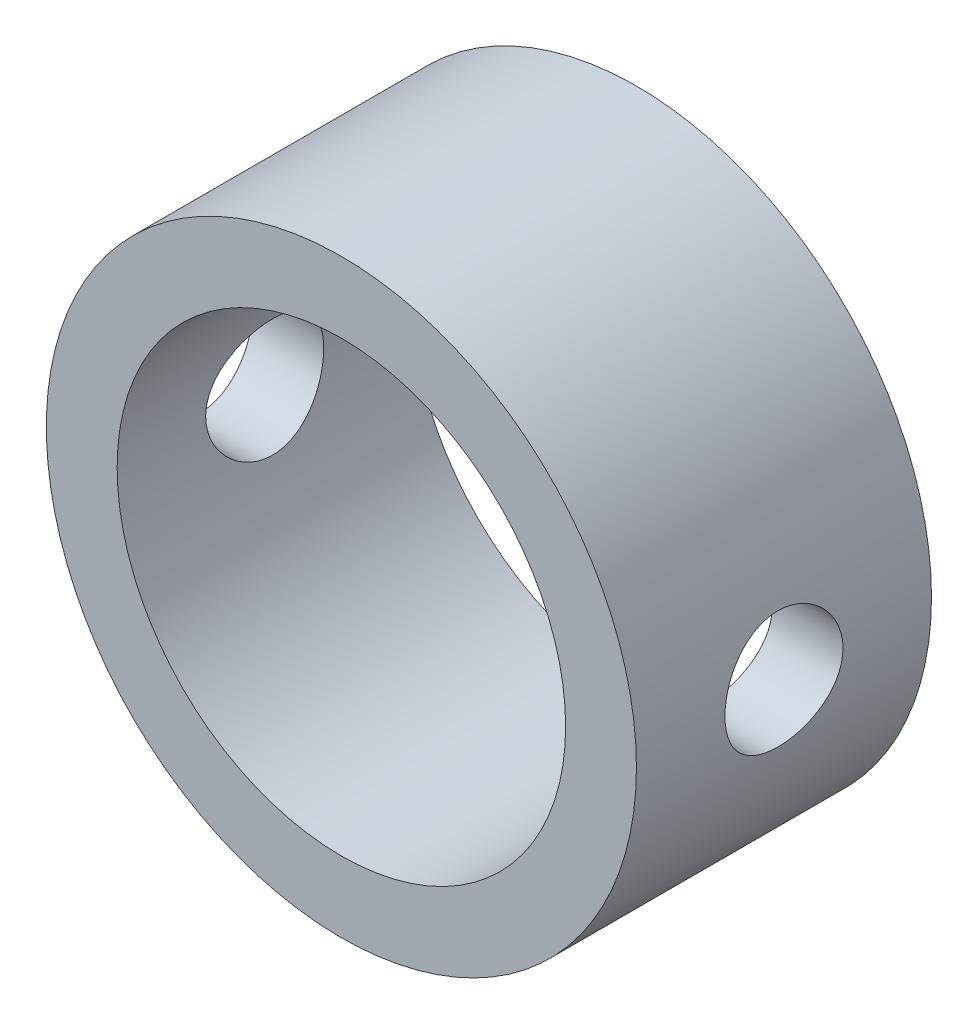
ISO-10303-21;
HEADER;
FILE_DESCRIPTION(('STEP AP214'),'2;1');
FILE_NAME('part.step','',(''),(''),'','','');
FILE_SCHEMA(('AUTOMOTIVE_DESIGN { 1 0 10303 214 1 1 1 1 }'));
ENDSEC;
DATA;
#1=APPLICATION_CONTEXT('core data for automotive mechanical design processes');
#2=APPLICATION_PROTOCOL_DEFINITION('international standard','automotive_design',2000,#1);
#3=PRODUCT_CONTEXT('',#1,'mechanical');
#4=PRODUCT('Part','Part','',(#3));
#5=PRODUCT_RELATED_PRODUCT_CATEGORY('part','',(#4));
#6=PRODUCT_DEFINITION_FORMATION('','',#4);
#7=PRODUCT_DEFINITION_CONTEXT('part definition',#1,'design');
#8=PRODUCT_DEFINITION('design','',#6,#7);
#9=PRODUCT_DEFINITION_SHAPE('','',#8);
#10=(LENGTH_UNIT() NAMED_UNIT(*) SI_UNIT(.MILLI.,.METRE.));
#11=(NAMED_UNIT(*) PLANE_ANGLE_UNIT() SI_UNIT($,.RADIAN.));
#12=(NAMED_UNIT(*) SI_UNIT($,.STERADIAN.) SOLID_ANGLE_UNIT());
#13=UNCERTAINTY_MEASURE_WITH_UNIT(LENGTH_MEASURE(1.E-05),#10,'distance_accuracy_value','');
#14=(GEOMETRIC_REPRESENTATION_CONTEXT(3) GLOBAL_UNCERTAINTY_ASSIGNED_CONTEXT((#13)) GLOBAL_UNIT_ASSIGNED_CONTEXT((#10,
#11,#12)) REPRESENTATION_CONTEXT('',''));
#15=CARTESIAN_POINT('',(0.,0.,0.));
#16=DIRECTION('',(0.,0.,1.));
#17=DIRECTION('',(1.,0.,0.));
#18=AXIS2_PLACEMENT_3D('',#15,#16,#17);
#19=CARTESIAN_POINT('',(0.,0.,10.));
#20=DIRECTION('',(0.,0.,1.));
#21=DIRECTION('',(1.,0.,0.));
#22=AXIS2_PLACEMENT_3D('',#19,#20,#21);
#23=PLANE('',#22);
#24=CARTESIAN_POINT('',(0.,0.,10.));
#25=DIRECTION('',(0.,0.,1.));
#26=DIRECTION('',(1.,0.,0.));
#27=AXIS2_PLACEMENT_3D('',#24,#25,#26);
#28=CIRCLE('',#27,10.);
#29=CARTESIAN_POINT('',(10.,0.,10.));
#30=VERTEX_POINT('',#29);
#31=EDGE_CURVE('E10',#30,#30,#28,.T.);
#32=ORIENTED_EDGE('',*,*,#31,.T.);
#33=EDGE_LOOP('',(#32));
#34=FACE_BOUND('',#33,.T.);
#35=CARTESIAN_POINT('',(0.,0.,10.));
#36=DIRECTION('',(0.,0.,1.));
#37=DIRECTION('',(1.,0.,0.));
#38=AXIS2_PLACEMENT_3D('',#35,#36,#37);
#39=CIRCLE('',#38,7.6);
#40=CARTESIAN_POINT('',(7.6,0.,10.));
#41=VERTEX_POINT('',#40);
#42=EDGE_CURVE('E54',#41,#41,#39,.T.);
#43=ORIENTED_EDGE('',*,*,#42,.F.);
#44=EDGE_LOOP('',(#43));
#45=FACE_BOUND('',#44,.T.);
#46=ADVANCED_FACE('F35',(#34,#45),#23,.T.);
#47=CARTESIAN_POINT('',(0.,0.,0.));
#48=DIRECTION('',(0.,0.,1.));
#49=DIRECTION('',(1.,0.,0.));
#50=AXIS2_PLACEMENT_3D('',#47,#48,#49);
#51=PLANE('',#50);
#52=CARTESIAN_POINT('',(0.,0.,0.));
#53=DIRECTION('',(0.,0.,1.));
#54=DIRECTION('',(1.,0.,0.));
#55=AXIS2_PLACEMENT_3D('',#52,#53,#54);
#56=CIRCLE('',#55,10.);
#57=CARTESIAN_POINT('',(10.,0.,0.));
#58=VERTEX_POINT('',#57);
#59=EDGE_CURVE('E49',#58,#58,#56,.T.);
#60=ORIENTED_EDGE('',*,*,#59,.F.);
#61=EDGE_LOOP('',(#60));
#62=FACE_BOUND('',#61,.T.);
#63=CARTESIAN_POINT('',(0.,0.,0.));
#64=DIRECTION('',(0.,0.,1.));
#65=DIRECTION('',(1.,0.,0.));
#66=AXIS2_PLACEMENT_3D('',#63,#64,#65);
#67=CIRCLE('',#66,7.6);
#68=CARTESIAN_POINT('',(7.6,0.,0.));
#69=VERTEX_POINT('',#68);
#70=EDGE_CURVE('E57',#69,#69,#67,.T.);
#71=ORIENTED_EDGE('',*,*,#70,.T.);
#72=EDGE_LOOP('',(#71));
#73=FACE_BOUND('',#72,.T.);
#74=ADVANCED_FACE('F93',(#62,#73),#51,.F.);
#75=CARTESIAN_POINT('',(0.,0.,10.));
#76=DIRECTION('',(0.,0.,-1.));
#77=DIRECTION('',(-1.,0.,0.));
#78=AXIS2_PLACEMENT_3D('',#75,#76,#77);
#79=CYLINDRICAL_SURFACE('',#78,10.);
#80=CARTESIAN_POINT('',(-10.,0.,3.));
#81=CARTESIAN_POINT('',(-9.99999795161742,0.111153813585266,3.00000408899669));
#82=CARTESIAN_POINT('',(-9.99812770356462,0.222359320403045,3.00929768593529));
#83=CARTESIAN_POINT('',(-9.99084731246463,0.441627015378039,3.04619700023049));
#84=CARTESIAN_POINT('',(-9.98543435720372,0.549686635082711,3.07381726560302));
#85=CARTESIAN_POINT('',(-9.97167298556573,0.759460610526626,3.14648254724158));
#86=CARTESIAN_POINT('',(-9.96332738153436,0.861180935866268,3.19151087368938));
#87=CARTESIAN_POINT('',(-9.94460796070629,1.05561597772845,3.29766449502259));
#88=CARTESIAN_POINT('',(-9.93423426471414,1.14833123015162,3.35878883121441));
#89=CARTESIAN_POINT('',(-9.9124433065994,1.32338695462973,3.49627698858287));
#90=CARTESIAN_POINT('',(-9.90101491008695,1.40558790231705,3.5728167107824));
#91=CARTESIAN_POINT('',(-9.87848360905177,1.55607351321606,3.7385848327834));
#92=CARTESIAN_POINT('',(-9.86738073000848,1.62435708954085,3.82781422267024));
#93=CARTESIAN_POINT('',(-9.8466488362523,1.74566350669524,4.01743238602375));
#94=CARTESIAN_POINT('',(-9.83703414729892,1.79854187773173,4.11791528759272));
#95=CARTESIAN_POINT('',(-9.82052536116836,1.88661133316062,4.32656363800816));
#96=CARTESIAN_POINT('',(-9.81363099523923,1.92180416487448,4.43472832669269));
#97=CARTESIAN_POINT('',(-9.80345610504409,1.97305059976965,4.65416872781583));
#98=CARTESIAN_POINT('',(-9.80012940214375,1.98934899591755,4.76538508828445));
#99=CARTESIAN_POINT('',(-9.79732750121254,2.00310425545224,4.98901964272868));
#100=CARTESIAN_POINT('',(-9.79785190935681,2.000563045427,5.10143771264029));
#101=CARTESIAN_POINT('',(-9.80265102296369,1.97690914620364,5.32249357604201));
#102=CARTESIAN_POINT('',(-9.80686905717527,1.95607708048781,5.43116281125463));
#103=CARTESIAN_POINT('',(-9.81849092320002,1.8968757692461,5.643432153326));
#104=CARTESIAN_POINT('',(-9.82589490715558,1.85850568620136,5.74703201783801));
#105=CARTESIAN_POINT('',(-9.84311237000816,1.76504956734944,5.9470305234072));
#106=CARTESIAN_POINT('',(-9.85294179627409,1.70985230246423,6.04337575913834));
#107=CARTESIAN_POINT('',(-9.87389237546124,1.58438714914536,6.22554169994563));
#108=CARTESIAN_POINT('',(-9.88501367676732,1.51411752871366,6.31136119370231));
#109=CARTESIAN_POINT('',(-9.90754042482924,1.35899986912117,6.47165880491387));
#110=CARTESIAN_POINT('',(-9.9189473842181,1.27391232242489,6.54590513571826));
#111=CARTESIAN_POINT('',(-9.94057697428817,1.09237004812402,6.67910769260245));
#112=CARTESIAN_POINT('',(-9.95079958977947,0.995915174758779,6.73806372258716));
#113=CARTESIAN_POINT('',(-9.96893380321774,0.794118773757842,6.83905501845195));
#114=CARTESIAN_POINT('',(-9.97684177696544,0.688763639170601,6.88106378728907));
#115=CARTESIAN_POINT('',(-9.98942817975716,0.472297952897331,6.94672094807713));
#116=CARTESIAN_POINT('',(-9.99410700001063,0.3611881001449,6.97037156414726));
#117=CARTESIAN_POINT('',(-9.99965343733735,0.138358811254302,6.99831290758855));
#118=CARTESIAN_POINT('',(-10.0005834930494,0.0266806566511532,7.00292083908054));
#119=CARTESIAN_POINT('',(-9.99870103860205,-0.195849868385427,6.99350028211564));
#120=CARTESIAN_POINT('',(-9.99588873882892,-0.306702284887585,6.97947284129481));
#121=CARTESIAN_POINT('',(-9.98687664016035,-0.523411319893081,6.93344325291209));
#122=CARTESIAN_POINT('',(-9.98070752808413,-0.629303896679805,6.90160386300419));
#123=CARTESIAN_POINT('',(-9.96567104122065,-0.834247254999333,6.82103203468838));
#124=CARTESIAN_POINT('',(-9.95680346428454,-0.933297523275078,6.77229833064634));
#125=CARTESIAN_POINT('',(-9.93719823066589,-1.12308234737243,6.65863501869738));
#126=CARTESIAN_POINT('',(-9.92643900874104,-1.21370025350437,6.59351443792211));
#127=CARTESIAN_POINT('',(-9.90429469659765,-1.38283603823841,6.44918161758544));
#128=CARTESIAN_POINT('',(-9.89290953936776,-1.46135261786152,6.36996786720027));
#129=CARTESIAN_POINT('',(-9.8705860711393,-1.60528118154835,6.19825329621775));
#130=CARTESIAN_POINT('',(-9.85965720466609,-1.67047540489731,6.10556851155733));
#131=CARTESIAN_POINT('',(-9.83968383592389,-1.78437084010241,5.91037727728664));
#132=CARTESIAN_POINT('',(-9.83063925826685,-1.83307271184581,5.8078712208529));
#133=CARTESIAN_POINT('',(-9.81553481168766,-1.91230368316392,5.5964635077009));
#134=CARTESIAN_POINT('',(-9.80945949744373,-1.9429269995821,5.48759831757936));
#135=CARTESIAN_POINT('',(-9.8009487358405,-1.98541730325439,5.26613309301819));
#136=CARTESIAN_POINT('',(-9.79851281382223,-1.99728673645022,5.15353354758131));
#137=CARTESIAN_POINT('',(-9.79758299262758,-2.00184182173494,4.92998227091136));
#138=CARTESIAN_POINT('',(-9.79901838378602,-1.99487157614179,4.81903770214598));
#139=CARTESIAN_POINT('',(-9.80551146969228,-1.96270460820012,4.59993670018995));
#140=CARTESIAN_POINT('',(-9.81056913534338,-1.9375080322586,4.49178024461039));
#141=CARTESIAN_POINT('',(-9.82370528438317,-1.86975713699791,4.28154457751891));
#142=CARTESIAN_POINT('',(-9.83177642037661,-1.82724501343469,4.17945127899517));
#143=CARTESIAN_POINT('',(-9.85003429948341,-1.72610928920321,3.98379255853112));
#144=CARTESIAN_POINT('',(-9.86022121997788,-1.66748433754977,3.89022785254973));
#145=CARTESIAN_POINT('',(-9.88177921046451,-1.53461182957283,3.71256885569937));
#146=CARTESIAN_POINT('',(-9.89316745819399,-1.46011577447036,3.62866246946481));
#147=CARTESIAN_POINT('',(-9.91572163743909,-1.29812873802628,3.47442758894166));
#148=CARTESIAN_POINT('',(-9.92688751726369,-1.21063477430667,3.40410221936546));
#149=CARTESIAN_POINT('',(-9.94787664775943,-1.02403525817649,3.27833071210711));
#150=CARTESIAN_POINT('',(-9.95768462438492,-0.92481776885967,3.22304799343995));
#151=CARTESIAN_POINT('',(-9.9747025017,-0.718332721881466,3.13002775480682));
#152=CARTESIAN_POINT('',(-9.98191474277232,-0.611072521726253,3.09227442093502));
#153=CARTESIAN_POINT('',(-9.99152745190741,-0.419642977847559,3.04269610391057));
#154=CARTESIAN_POINT('',(-9.99468606316904,-0.336563328027569,3.02671361258448));
#155=CARTESIAN_POINT('',(-9.99892308279786,-0.168999050420134,3.00536417528327));
#156=CARTESIAN_POINT('',(-10.0000015574631,-0.0845144674972379,2.99999689098046));
#157=CARTESIAN_POINT('',(-10.,0.,3.));
#158=B_SPLINE_CURVE_WITH_KNOTS('',3,(#80,#81,#82,#83,#84,#85,#86,#87,#88,#89,#90,#91,#92,#93,
#94,#95,#96,#97,#98,#99,#100,#101,#102,#103,#104,#105,#106,#107,#108,#109,#110,#111,#112,#113,
#114,#115,#116,#117,#118,#119,#120,#121,#122,#123,#124,#125,#126,#127,#128,#129,#130,#131,#132,
#133,#134,#135,#136,#137,#138,#139,#140,#141,#142,#143,#144,#145,#146,#147,#148,#149,#150,#151,
#152,#153,#154,#155,#156,#157),.UNSPECIFIED.,.T.,.F.,(4,2,2,2,2,2,2,2,2,2,2,2,2,2,2,2,2,2,2,2,2,
2,2,2,2,2,2,2,2,2,2,2,2,2,2,2,2,2,4),(0.,0.333152261322517,0.666569301382646,0.999667470500683,
1.33274580446173,1.66986534022437,2.00701119349473,2.34722390011845,2.68740298730395,
3.02312370207175,3.3588100856245,3.68943454012557,4.02007478507459,4.35294980407185,
4.68586309499341,5.02476504982701,5.36367135079641,5.70310549708048,6.04249851396072,
6.3762147135253,6.70991215315735,7.04060907901447,7.37133078432045,7.70610132066717,
8.0409077669186,8.38081257158452,8.72070377446933,9.05880762065446,9.3968673666083,
9.72879445135403,10.0607188698522,10.3918392250622,10.7229873516373,11.0597615247829,
11.3966130906586,11.7369899335127,12.0770591103504,12.3303755057979,12.5836838274199),.UNSPECIFIED.);
#159=CARTESIAN_POINT('',(-10.,0.,3.));
#160=VERTEX_POINT('',#159);
#161=EDGE_CURVE('E82',#160,#160,#158,.T.);
#162=ORIENTED_EDGE('',*,*,#161,.T.);
#163=EDGE_LOOP('',(#162));
#164=FACE_BOUND('',#163,.T.);
#165=CARTESIAN_POINT('',(10.,0.,3.));
#166=CARTESIAN_POINT('',(9.99999795161742,-0.111153813585266,3.00000408899669));
#167=CARTESIAN_POINT('',(9.99812770356462,-0.222359320403045,3.00929768593529));
#168=CARTESIAN_POINT('',(9.99084731246463,-0.441627015378039,3.04619700023049));
#169=CARTESIAN_POINT('',(9.98543435720372,-0.549686635082711,3.07381726560302));
#170=CARTESIAN_POINT('',(9.97167298556573,-0.759460610526626,3.14648254724158));
#171=CARTESIAN_POINT('',(9.96332738153436,-0.861180935866268,3.19151087368938));
#172=CARTESIAN_POINT('',(9.94460796070629,-1.05561597772845,3.29766449502259));
#173=CARTESIAN_POINT('',(9.93423426471414,-1.14833123015162,3.35878883121441));
#174=CARTESIAN_POINT('',(9.9124433065994,-1.32338695462973,3.49627698858287));
#175=CARTESIAN_POINT('',(9.90101491008695,-1.40558790231705,3.5728167107824));
#176=CARTESIAN_POINT('',(9.87848360905177,-1.55607351321606,3.7385848327834));
#177=CARTESIAN_POINT('',(9.86738073000848,-1.62435708954085,3.82781422267024));
#178=CARTESIAN_POINT('',(9.8466488362523,-1.74566350669524,4.01743238602375));
#179=CARTESIAN_POINT('',(9.83703414729892,-1.79854187773173,4.11791528759272));
#180=CARTESIAN_POINT('',(9.82052536116836,-1.88661133316062,4.32656363800816));
#181=CARTESIAN_POINT('',(9.81363099523923,-1.92180416487448,4.43472832669269));
#182=CARTESIAN_POINT('',(9.80345610504409,-1.97305059976965,4.65416872781583));
#183=CARTESIAN_POINT('',(9.80012940214375,-1.98934899591755,4.76538508828445));
#184=CARTESIAN_POINT('',(9.79732750121254,-2.00310425545224,4.98901964272868));
#185=CARTESIAN_POINT('',(9.79785190935681,-2.000563045427,5.10143771264029));
#186=CARTESIAN_POINT('',(9.80265102296369,-1.97690914620364,5.32249357604201));
#187=CARTESIAN_POINT('',(9.80686905717527,-1.95607708048781,5.43116281125463));
#188=CARTESIAN_POINT('',(9.81849092320002,-1.8968757692461,5.643432153326));
#189=CARTESIAN_POINT('',(9.82589490715558,-1.85850568620136,5.74703201783801));
#190=CARTESIAN_POINT('',(9.84311237000816,-1.76504956734944,5.9470305234072));
#191=CARTESIAN_POINT('',(9.85294179627409,-1.70985230246423,6.04337575913834));
#192=CARTESIAN_POINT('',(9.87389237546124,-1.58438714914536,6.22554169994563));
#193=CARTESIAN_POINT('',(9.88501367676732,-1.51411752871366,6.31136119370231));
#194=CARTESIAN_POINT('',(9.90754042482924,-1.35899986912117,6.47165880491387));
#195=CARTESIAN_POINT('',(9.9189473842181,-1.27391232242489,6.54590513571826));
#196=CARTESIAN_POINT('',(9.94057697428817,-1.09237004812402,6.67910769260245));
#197=CARTESIAN_POINT('',(9.95079958977947,-0.995915174758779,6.73806372258716));
#198=CARTESIAN_POINT('',(9.96893380321774,-0.794118773757842,6.83905501845195));
#199=CARTESIAN_POINT('',(9.97684177696544,-0.688763639170601,6.88106378728907));
#200=CARTESIAN_POINT('',(9.98942817975716,-0.472297952897331,6.94672094807713));
#201=CARTESIAN_POINT('',(9.99410700001063,-0.3611881001449,6.97037156414726));
#202=CARTESIAN_POINT('',(9.99965343733735,-0.138358811254302,6.99831290758855));
#203=CARTESIAN_POINT('',(10.0005834930494,-0.0266806566511532,7.00292083908054));
#204=CARTESIAN_POINT('',(9.99870103860205,0.195849868385427,6.99350028211564));
#205=CARTESIAN_POINT('',(9.99588873882892,0.306702284887585,6.97947284129481));
#206=CARTESIAN_POINT('',(9.98687664016035,0.523411319893081,6.93344325291209));
#207=CARTESIAN_POINT('',(9.98070752808413,0.629303896679805,6.90160386300419));
#208=CARTESIAN_POINT('',(9.96567104122065,0.834247254999333,6.82103203468838));
#209=CARTESIAN_POINT('',(9.95680346428454,0.933297523275078,6.77229833064634));
#210=CARTESIAN_POINT('',(9.93719823066589,1.12308234737243,6.65863501869738));
#211=CARTESIAN_POINT('',(9.92643900874104,1.21370025350437,6.59351443792211));
#212=CARTESIAN_POINT('',(9.90429469659765,1.38283603823841,6.44918161758544));
#213=CARTESIAN_POINT('',(9.89290953936776,1.46135261786152,6.36996786720027));
#214=CARTESIAN_POINT('',(9.8705860711393,1.60528118154835,6.19825329621775));
#215=CARTESIAN_POINT('',(9.85965720466609,1.67047540489731,6.10556851155733));
#216=CARTESIAN_POINT('',(9.83968383592389,1.78437084010241,5.91037727728664));
#217=CARTESIAN_POINT('',(9.83063925826685,1.83307271184581,5.8078712208529));
#218=CARTESIAN_POINT('',(9.81553481168766,1.91230368316392,5.5964635077009));
#219=CARTESIAN_POINT('',(9.80945949744373,1.9429269995821,5.48759831757936));
#220=CARTESIAN_POINT('',(9.8009487358405,1.98541730325439,5.26613309301819));
#221=CARTESIAN_POINT('',(9.79851281382223,1.99728673645022,5.15353354758131));
#222=CARTESIAN_POINT('',(9.79758299262758,2.00184182173494,4.92998227091136));
#223=CARTESIAN_POINT('',(9.79901838378602,1.99487157614179,4.81903770214598));
#224=CARTESIAN_POINT('',(9.80551146969228,1.96270460820012,4.59993670018995));
#225=CARTESIAN_POINT('',(9.81056913534338,1.9375080322586,4.49178024461039));
#226=CARTESIAN_POINT('',(9.82370528438317,1.86975713699791,4.28154457751891));
#227=CARTESIAN_POINT('',(9.83177642037661,1.82724501343469,4.17945127899517));
#228=CARTESIAN_POINT('',(9.85003429948341,1.72610928920321,3.98379255853112));
#229=CARTESIAN_POINT('',(9.86022121997788,1.66748433754977,3.89022785254973));
#230=CARTESIAN_POINT('',(9.88177921046451,1.53461182957283,3.71256885569937));
#231=CARTESIAN_POINT('',(9.89316745819399,1.46011577447036,3.62866246946481));
#232=CARTESIAN_POINT('',(9.91572163743909,1.29812873802628,3.47442758894166));
#233=CARTESIAN_POINT('',(9.92688751726369,1.21063477430667,3.40410221936546));
#234=CARTESIAN_POINT('',(9.94787664775943,1.02403525817649,3.27833071210711));
#235=CARTESIAN_POINT('',(9.95768462438492,0.92481776885967,3.22304799343995));
#236=CARTESIAN_POINT('',(9.9747025017,0.718332721881466,3.13002775480682));
#237=CARTESIAN_POINT('',(9.98191474277232,0.611072521726253,3.09227442093502));
#238=CARTESIAN_POINT('',(9.99152745190741,0.419642977847559,3.04269610391057));
#239=CARTESIAN_POINT('',(9.99468606316904,0.336563328027569,3.02671361258448));
#240=CARTESIAN_POINT('',(9.99892308279786,0.168999050420134,3.00536417528327));
#241=CARTESIAN_POINT('',(10.0000015574631,0.0845144674972379,2.99999689098046));
#242=CARTESIAN_POINT('',(10.,0.,3.));
#243=B_SPLINE_CURVE_WITH_KNOTS('',3,(#165,#166,#167,#168,#169,#170,#171,#172,#173,#174,#175,
#176,#177,#178,#179,#180,#181,#182,#183,#184,#185,#186,#187,#188,#189,#190,#191,#192,#193,#194,
#195,#196,#197,#198,#199,#200,#201,#202,#203,#204,#205,#206,#207,#208,#209,#210,#211,#212,#213,
#214,#215,#216,#217,#218,#219,#220,#221,#222,#223,#224,#225,#226,#227,#228,#229,#230,#231,#232,
#233,#234,#235,#236,#237,#238,#239,#240,#241,#242),.UNSPECIFIED.,.T.,.F.,(4,2,2,2,2,2,2,2,2,2,2,
2,2,2,2,2,2,2,2,2,2,2,2,2,2,2,2,2,2,2,2,2,2,2,2,2,2,2,4),(0.,0.333152261322517,
0.666569301382646,0.999667470500683,1.33274580446173,1.66986534022437,2.00701119349473,
2.34722390011845,2.68740298730395,3.02312370207175,3.3588100856245,3.68943454012557,
4.02007478507459,4.35294980407185,4.68586309499341,5.02476504982701,5.36367135079641,
5.70310549708048,6.04249851396072,6.3762147135253,6.70991215315735,7.04060907901447,
7.37133078432045,7.70610132066717,8.0409077669186,8.38081257158452,8.72070377446933,
9.05880762065446,9.3968673666083,9.72879445135403,10.0607188698522,10.3918392250622,
10.7229873516373,11.0597615247829,11.3966130906586,11.7369899335127,12.0770591103504,
12.3303755057979,12.5836838274199),.UNSPECIFIED.);
#244=CARTESIAN_POINT('',(10.,0.,3.));
#245=VERTEX_POINT('',#244);
#246=EDGE_CURVE('E77',#245,#245,#243,.T.);
#247=ORIENTED_EDGE('',*,*,#246,.T.);
#248=EDGE_LOOP('',(#247));
#249=FACE_BOUND('',#248,.T.);
#250=ORIENTED_EDGE('',*,*,#31,.F.);
#251=EDGE_LOOP('',(#250));
#252=FACE_BOUND('',#251,.T.);
#253=ORIENTED_EDGE('',*,*,#59,.T.);
#254=EDGE_LOOP('',(#253));
#255=FACE_BOUND('',#254,.T.);
#256=ADVANCED_FACE('F37',(#164,#249,#252,#255),#79,.T.);
#257=CARTESIAN_POINT('',(0.,0.,10.));
#258=DIRECTION('',(0.,0.,-1.));
#259=DIRECTION('',(-1.,0.,0.));
#260=AXIS2_PLACEMENT_3D('',#257,#258,#259);
#261=CYLINDRICAL_SURFACE('',#260,7.6);
#262=CARTESIAN_POINT('',(-7.6,0.,7.));
#263=CARTESIAN_POINT('',(-7.59999828714552,-0.110307730560133,6.99999727332697));
#264=CARTESIAN_POINT('',(-7.59757476442974,-0.220644935985643,6.99084353481075));
#265=CARTESIAN_POINT('',(-7.58814210091619,-0.438144337683257,6.95453308901949));
#266=CARTESIAN_POINT('',(-7.5811306691326,-0.545304919739092,6.92736738732782));
#267=CARTESIAN_POINT('',(-7.56329661060836,-0.753279836174661,6.85597473968142));
#268=CARTESIAN_POINT('',(-7.55247882716057,-0.854102044388118,6.81176946848748));
#269=CARTESIAN_POINT('',(-7.52817721226261,-1.04690122305247,6.70763198314898));
#270=CARTESIAN_POINT('',(-7.51469322173764,-1.13887766524863,6.64769883055689));
#271=CARTESIAN_POINT('',(-7.48617553309275,-1.3134559490354,6.51237470744187));
#272=CARTESIAN_POINT('',(-7.47111589382366,-1.39582907705723,6.43669413794759));
#273=CARTESIAN_POINT('',(-7.44131202366046,-1.54687267669245,6.27264275306714));
#274=CARTESIAN_POINT('',(-7.42656783246282,-1.61554143267683,6.18427035118859));
#275=CARTESIAN_POINT('',(-7.39879972888068,-1.73833366809745,5.99552898529889));
#276=CARTESIAN_POINT('',(-7.3858085903369,-1.79219559894539,5.89498459816491));
#277=CARTESIAN_POINT('',(-7.36339824512135,-1.8821611802115,5.68587031662129));
#278=CARTESIAN_POINT('',(-7.35397839897279,-1.91826801020807,5.57730186316783));
#279=CARTESIAN_POINT('',(-7.34004475767933,-1.97090716107826,5.35775045751483));
#280=CARTESIAN_POINT('',(-7.33542739495583,-1.98785342093871,5.24687348172334));
#281=CARTESIAN_POINT('',(-7.33131196120081,-2.00298065938738,5.02376159546161));
#282=CARTESIAN_POINT('',(-7.33181296060694,-2.0011650453797,4.91152693526287));
#283=CARTESIAN_POINT('',(-7.33778486187192,-1.979149052759,4.69210381644217));
#284=CARTESIAN_POINT('',(-7.34312080320096,-1.95944789524812,4.58486101301021));
#285=CARTESIAN_POINT('',(-7.35794548469441,-1.9030189360574,4.37525919705931));
#286=CARTESIAN_POINT('',(-7.36743454901552,-1.86628980530865,4.2729005664482));
#287=CARTESIAN_POINT('',(-7.38961608705182,-1.77643671868735,4.07466337033174));
#288=CARTESIAN_POINT('',(-7.40234273435973,-1.72313642535824,3.97886871674745));
#289=CARTESIAN_POINT('',(-7.42954689825237,-1.60177709616017,3.79740691268406));
#290=CARTESIAN_POINT('',(-7.44402475108877,-1.53371522390163,3.71174171344167));
#291=CARTESIAN_POINT('',(-7.47366321085344,-1.38220501716882,3.55011640603572));
#292=CARTESIAN_POINT('',(-7.48883090576095,-1.29833701281234,3.47455046241615));
#293=CARTESIAN_POINT('',(-7.51772761269716,-1.11893447236056,3.33847627648179));
#294=CARTESIAN_POINT('',(-7.53145657091021,-1.02339950015396,3.27796859730194));
#295=CARTESIAN_POINT('',(-7.55600975901614,-0.82277487026988,3.17356125603069));
#296=CARTESIAN_POINT('',(-7.56682173537758,-0.717647314974279,3.12973134653084));
#297=CARTESIAN_POINT('',(-7.58423407316033,-0.50116682028137,3.06047966896322));
#298=CARTESIAN_POINT('',(-7.59083533002147,-0.389815209955924,3.03505398694887));
#299=CARTESIAN_POINT('',(-7.59894765438889,-0.167412666022036,3.0039477434924));
#300=CARTESIAN_POINT('',(-7.60059688444822,-0.0564416383871428,2.99773109839775));
#301=CARTESIAN_POINT('',(-7.5990157568394,0.16495686985393,3.00374111690053));
#302=CARTESIAN_POINT('',(-7.59578588936938,0.27538440394612,3.01596592770282));
#303=CARTESIAN_POINT('',(-7.58489857100534,0.490658812331468,3.05807163649291));
#304=CARTESIAN_POINT('',(-7.57731579392175,0.595568016421661,3.08765493602793));
#305=CARTESIAN_POINT('',(-7.55858152533492,0.798925563600332,3.16329349643487));
#306=CARTESIAN_POINT('',(-7.54742965240509,0.897373214791765,3.20935051790303));
#307=CARTESIAN_POINT('',(-7.5224689005433,1.087106884953,3.31763305770661));
#308=CARTESIAN_POINT('',(-7.50861311209609,1.17821907925447,3.38015207165798));
#309=CARTESIAN_POINT('',(-7.47984688525879,1.34884778064121,3.51921362431206));
#310=CARTESIAN_POINT('',(-7.46493624454205,1.4283620541759,3.59575885782469));
#311=CARTESIAN_POINT('',(-7.4352348380538,1.57578615105465,3.76319920856277));
#312=CARTESIAN_POINT('',(-7.42045855902877,1.6433181824352,3.85443013067817));
#313=CARTESIAN_POINT('',(-7.39314959630072,1.7621206182736,4.04724039689845));
#314=CARTESIAN_POINT('',(-7.38061681721743,1.81339171412129,4.14881930078045));
#315=CARTESIAN_POINT('',(-7.35935694580314,1.8978309121971,4.35892498766296));
#316=CARTESIAN_POINT('',(-7.3506077028033,1.93110467542322,4.46740694497724));
#317=CARTESIAN_POINT('',(-7.33789680527255,1.97886148433562,4.68869458185313));
#318=CARTESIAN_POINT('',(-7.33393396608941,1.99334917970686,4.80149918441032));
#319=CARTESIAN_POINT('',(-7.33134168191522,2.00286032469265,5.0243673421597));
#320=CARTESIAN_POINT('',(-7.33254605516003,1.99849022962561,5.13440347625629));
#321=CARTESIAN_POINT('',(-7.33976445825453,1.97181256046432,5.35211040335236));
#322=CARTESIAN_POINT('',(-7.34577837041293,1.94950542529638,5.45978125416501));
#323=CARTESIAN_POINT('',(-7.3618406508767,1.88793420922453,5.66896036119323));
#324=CARTESIAN_POINT('',(-7.37185916244945,1.84879545796601,5.7705079608682));
#325=CARTESIAN_POINT('',(-7.39480324107711,1.75476964730114,5.9656713309879));
#326=CARTESIAN_POINT('',(-7.40772925305212,1.69988017728703,6.05928588445698));
#327=CARTESIAN_POINT('',(-7.43549553134529,1.57405944722419,6.23882833006595));
#328=CARTESIAN_POINT('',(-7.45038010513534,1.5027128303594,6.32445833405862));
#329=CARTESIAN_POINT('',(-7.48013537399376,1.34679721909923,6.48272753068859));
#330=CARTESIAN_POINT('',(-7.49500606483625,1.26222503185927,6.55536357729419));
#331=CARTESIAN_POINT('',(-7.52342540654559,1.08014966904107,6.68705619708457));
#332=CARTESIAN_POINT('',(-7.53694038190439,0.982415365446775,6.74580108779218));
#333=CARTESIAN_POINT('',(-7.56076012805248,0.778107103332893,6.84593396047491));
#334=CARTESIAN_POINT('',(-7.57106701000187,0.671539016816949,6.88733336328497));
#335=CARTESIAN_POINT('',(-7.5859349673448,0.471100637221477,6.9460384721217));
#336=CARTESIAN_POINT('',(-7.59117140003552,0.378114681591974,6.96622776042776));
#337=CARTESIAN_POINT('',(-7.59820449391819,0.190092985352381,6.99320907422099));
#338=CARTESIAN_POINT('',(-7.60000147604846,0.0950574368286506,7.0000023497043));
#339=CARTESIAN_POINT('',(-7.6,0.,7.));
#340=B_SPLINE_CURVE_WITH_KNOTS('',3,(#262,#263,#264,#265,#266,#267,#268,#269,#270,#271,#272,
#273,#274,#275,#276,#277,#278,#279,#280,#281,#282,#283,#284,#285,#286,#287,#288,#289,#290,#291,
#292,#293,#294,#295,#296,#297,#298,#299,#300,#301,#302,#303,#304,#305,#306,#307,#308,#309,#310,
#311,#312,#313,#314,#315,#316,#317,#318,#319,#320,#321,#322,#323,#324,#325,#326,#327,#328,#329,
#330,#331,#332,#333,#334,#335,#336,#337,#338,#339),.UNSPECIFIED.,.T.,.F.,(4,2,2,2,2,2,2,2,2,2,2,
2,2,2,2,2,2,2,2,2,2,2,2,2,2,2,2,2,2,2,2,2,2,2,2,2,2,2,4),(0.,0.330574645834023,
0.661314491187416,0.991635008125812,1.32197523903445,1.65903413949998,1.99613520941282,
2.33885568494099,2.68151476381289,3.01662056728243,3.3516655121819,3.67763689182931,
4.00363371850887,4.33322568429279,4.66288103630069,5.00299580592632,5.34312329293655,
5.68465807920426,6.02612021140573,6.35796260710344,6.68977166513867,7.01605177441632,
7.34236676465521,7.67494788505055,8.00759297025067,8.34935532098778,8.69110313856947,
9.0308221805077,9.37045712351517,9.69925242300548,10.0280396769924,10.3544200269369,
10.6808503552366,11.0166535224827,11.3525378829913,11.6953641850873,12.0379644030747,
12.3228629404097,12.6077348923025),.UNSPECIFIED.);
#341=CARTESIAN_POINT('',(-7.6,0.,7.));
#342=VERTEX_POINT('',#341);
#343=EDGE_CURVE('E40',#342,#342,#340,.T.);
#344=ORIENTED_EDGE('',*,*,#343,.F.);
#345=EDGE_LOOP('',(#344));
#346=FACE_BOUND('',#345,.T.);
#347=CARTESIAN_POINT('',(7.6,0.,3.));
#348=CARTESIAN_POINT('',(7.59999828714552,-0.110307730560133,3.00000272667303));
#349=CARTESIAN_POINT('',(7.59757476442974,-0.220644935985643,3.00915646518925));
#350=CARTESIAN_POINT('',(7.58814210091619,-0.438144337683257,3.04546691098051));
#351=CARTESIAN_POINT('',(7.5811306691326,-0.545304919739092,3.07263261267218));
#352=CARTESIAN_POINT('',(7.56329661060836,-0.75327983617466,3.14402526031858));
#353=CARTESIAN_POINT('',(7.55247882716057,-0.854102044388117,3.18823053151253));
#354=CARTESIAN_POINT('',(7.52817721226261,-1.04690122305247,3.29236801685102));
#355=CARTESIAN_POINT('',(7.51469322173764,-1.13887766524863,3.35230116944311));
#356=CARTESIAN_POINT('',(7.48617553309275,-1.3134559490354,3.48762529255813));
#357=CARTESIAN_POINT('',(7.47111589382366,-1.39582907705722,3.56330586205241));
#358=CARTESIAN_POINT('',(7.44131202366046,-1.54687267669245,3.72735724693286));
#359=CARTESIAN_POINT('',(7.42656783246282,-1.61554143267683,3.81572964881141));
#360=CARTESIAN_POINT('',(7.39879972888068,-1.73833366809745,4.00447101470111));
#361=CARTESIAN_POINT('',(7.3858085903369,-1.79219559894539,4.10501540183509));
#362=CARTESIAN_POINT('',(7.36339824512135,-1.8821611802115,4.31412968337871));
#363=CARTESIAN_POINT('',(7.35397839897279,-1.91826801020807,4.42269813683217));
#364=CARTESIAN_POINT('',(7.34004475767933,-1.97090716107826,4.64224954248517));
#365=CARTESIAN_POINT('',(7.33542739495583,-1.98785342093871,4.75312651827666));
#366=CARTESIAN_POINT('',(7.33131196120081,-2.00298065938738,4.97623840453839));
#367=CARTESIAN_POINT('',(7.33181296060694,-2.0011650453797,5.08847306473713));
#368=CARTESIAN_POINT('',(7.33778486187192,-1.979149052759,5.30789618355783));
#369=CARTESIAN_POINT('',(7.34312080320096,-1.95944789524812,5.41513898698979));
#370=CARTESIAN_POINT('',(7.35794548469441,-1.9030189360574,5.62474080294069));
#371=CARTESIAN_POINT('',(7.36743454901552,-1.86628980530865,5.7270994335518));
#372=CARTESIAN_POINT('',(7.38961608705182,-1.77643671868735,5.92533662966826));
#373=CARTESIAN_POINT('',(7.40234273435973,-1.72313642535824,6.02113128325255));
#374=CARTESIAN_POINT('',(7.42954689825237,-1.60177709616017,6.20259308731594));
#375=CARTESIAN_POINT('',(7.44402475108877,-1.53371522390164,6.28825828655833));
#376=CARTESIAN_POINT('',(7.47366321085344,-1.38220501716882,6.44988359396428));
#377=CARTESIAN_POINT('',(7.48883090576095,-1.29833701281234,6.52544953758385));
#378=CARTESIAN_POINT('',(7.51772761269716,-1.11893447236056,6.66152372351821));
#379=CARTESIAN_POINT('',(7.53145657091021,-1.02339950015396,6.72203140269806));
#380=CARTESIAN_POINT('',(7.55600975901614,-0.82277487026988,6.82643874396931));
#381=CARTESIAN_POINT('',(7.56682173537758,-0.71764731497428,6.87026865346916));
#382=CARTESIAN_POINT('',(7.58423407316033,-0.501166820281371,6.93952033103678));
#383=CARTESIAN_POINT('',(7.59083533002147,-0.389815209955925,6.96494601305113));
#384=CARTESIAN_POINT('',(7.59894765438889,-0.167412666022036,6.9960522565076));
#385=CARTESIAN_POINT('',(7.60059688444822,-0.0564416383871434,7.00226890160225));
#386=CARTESIAN_POINT('',(7.5990157568394,0.16495686985393,6.99625888309947));
#387=CARTESIAN_POINT('',(7.59578588936938,0.27538440394612,6.98403407229718));
#388=CARTESIAN_POINT('',(7.58489857100534,0.490658812331467,6.94192836350709));
#389=CARTESIAN_POINT('',(7.57731579392175,0.59556801642166,6.91234506397207));
#390=CARTESIAN_POINT('',(7.55858152533492,0.798925563600331,6.83670650356513));
#391=CARTESIAN_POINT('',(7.54742965240509,0.897373214791765,6.79064948209697));
#392=CARTESIAN_POINT('',(7.5224689005433,1.087106884953,6.68236694229339));
#393=CARTESIAN_POINT('',(7.50861311209609,1.17821907925447,6.61984792834202));
#394=CARTESIAN_POINT('',(7.47984688525879,1.34884778064121,6.48078637568794));
#395=CARTESIAN_POINT('',(7.46493624454205,1.4283620541759,6.40424114217531));
#396=CARTESIAN_POINT('',(7.4352348380538,1.57578615105465,6.23680079143723));
#397=CARTESIAN_POINT('',(7.42045855902877,1.6433181824352,6.14556986932183));
#398=CARTESIAN_POINT('',(7.39314959630072,1.7621206182736,5.95275960310155));
#399=CARTESIAN_POINT('',(7.38061681721743,1.81339171412129,5.85118069921955));
#400=CARTESIAN_POINT('',(7.35935694580314,1.8978309121971,5.64107501233704));
#401=CARTESIAN_POINT('',(7.3506077028033,1.93110467542322,5.53259305502276));
#402=CARTESIAN_POINT('',(7.33789680527255,1.97886148433562,5.31130541814687));
#403=CARTESIAN_POINT('',(7.33393396608941,1.99334917970686,5.19850081558968));
#404=CARTESIAN_POINT('',(7.33134168191522,2.00286032469265,4.9756326578403));
#405=CARTESIAN_POINT('',(7.33254605516003,1.99849022962561,4.86559652374371));
#406=CARTESIAN_POINT('',(7.33976445825453,1.97181256046432,4.64788959664764));
#407=CARTESIAN_POINT('',(7.34577837041293,1.94950542529638,4.54021874583499));
#408=CARTESIAN_POINT('',(7.3618406508767,1.88793420922453,4.33103963880677));
#409=CARTESIAN_POINT('',(7.37185916244945,1.84879545796601,4.2294920391318));
#410=CARTESIAN_POINT('',(7.39480324107711,1.75476964730114,4.0343286690121));
#411=CARTESIAN_POINT('',(7.40772925305212,1.69988017728704,3.94071411554302));
#412=CARTESIAN_POINT('',(7.43549553134529,1.57405944722419,3.76117166993405));
#413=CARTESIAN_POINT('',(7.45038010513534,1.5027128303594,3.67554166594138));
#414=CARTESIAN_POINT('',(7.48013537399376,1.34679721909923,3.51727246931141));
#415=CARTESIAN_POINT('',(7.49500606483625,1.26222503185927,3.44463642270582));
#416=CARTESIAN_POINT('',(7.52342540654559,1.08014966904107,3.31294380291543));
#417=CARTESIAN_POINT('',(7.53694038190439,0.982415365446776,3.25419891220782));
#418=CARTESIAN_POINT('',(7.56076012805248,0.778107103332893,3.15406603952509));
#419=CARTESIAN_POINT('',(7.57106701000187,0.671539016816949,3.11266663671503));
#420=CARTESIAN_POINT('',(7.5859349673448,0.471100637221477,3.0539615278783));
#421=CARTESIAN_POINT('',(7.59117140003552,0.378114681591975,3.03377223957223));
#422=CARTESIAN_POINT('',(7.59820449391819,0.190092985352382,3.006790925779));
#423=CARTESIAN_POINT('',(7.60000147604846,0.0950574368286508,2.9999976502957));
#424=CARTESIAN_POINT('',(7.6,0.,3.));
#425=B_SPLINE_CURVE_WITH_KNOTS('',3,(#347,#348,#349,#350,#351,#352,#353,#354,#355,#356,#357,
#358,#359,#360,#361,#362,#363,#364,#365,#366,#367,#368,#369,#370,#371,#372,#373,#374,#375,#376,
#377,#378,#379,#380,#381,#382,#383,#384,#385,#386,#387,#388,#389,#390,#391,#392,#393,#394,#395,
#396,#397,#398,#399,#400,#401,#402,#403,#404,#405,#406,#407,#408,#409,#410,#411,#412,#413,#414,
#415,#416,#417,#418,#419,#420,#421,#422,#423,#424),.UNSPECIFIED.,.T.,.F.,(4,2,2,2,2,2,2,2,2,2,2,
2,2,2,2,2,2,2,2,2,2,2,2,2,2,2,2,2,2,2,2,2,2,2,2,2,2,2,4),(0.,0.330574645834023,
0.661314491187415,0.991635008125812,1.32197523903445,1.65903413949998,1.99613520941281,
2.33885568494099,2.68151476381289,3.01662056728243,3.3516655121819,3.67763689182931,
4.00363371850887,4.33322568429278,4.66288103630069,5.00299580592632,5.34312329293655,
5.68465807920426,6.02612021140573,6.35796260710344,6.68977166513867,7.01605177441632,
7.34236676465521,7.67494788505055,8.00759297025066,8.34935532098778,8.69110313856947,
9.0308221805077,9.37045712351516,9.69925242300548,10.0280396769924,10.3544200269369,
10.6808503552366,11.0166535224827,11.3525378829913,11.6953641850873,12.0379644030747,
12.3228629404097,12.6077348923025),.UNSPECIFIED.);
#426=CARTESIAN_POINT('',(7.6,0.,3.));
#427=VERTEX_POINT('',#426);
#428=EDGE_CURVE('E59',#427,#427,#425,.T.);
#429=ORIENTED_EDGE('',*,*,#428,.F.);
#430=EDGE_LOOP('',(#429));
#431=FACE_BOUND('',#430,.T.);
#432=ORIENTED_EDGE('',*,*,#42,.T.);
#433=EDGE_LOOP('',(#432));
#434=FACE_BOUND('',#433,.T.);
#435=ORIENTED_EDGE('',*,*,#70,.F.);
#436=EDGE_LOOP('',(#435));
#437=FACE_BOUND('',#436,.T.);
#438=ADVANCED_FACE('F64',(#346,#431,#434,#437),#261,.F.);
#439=CARTESIAN_POINT('',(-10.,0.,5.));
#440=DIRECTION('',(1.,0.,0.));
#441=DIRECTION('',(0.,0.,-1.));
#442=AXIS2_PLACEMENT_3D('',#439,#440,#441);
#443=CYLINDRICAL_SURFACE('',#442,2.);
#444=ORIENTED_EDGE('',*,*,#428,.T.);
#445=EDGE_LOOP('',(#444));
#446=FACE_BOUND('',#445,.T.);
#447=ORIENTED_EDGE('',*,*,#246,.F.);
#448=EDGE_LOOP('',(#447));
#449=FACE_BOUND('',#448,.T.);
#450=ADVANCED_FACE('F70',(#446,#449),#443,.F.);
#451=ORIENTED_EDGE('',*,*,#343,.T.);
#452=EDGE_LOOP('',(#451));
#453=FACE_BOUND('',#452,.T.);
#454=ORIENTED_EDGE('',*,*,#161,.F.);
#455=EDGE_LOOP('',(#454));
#456=FACE_BOUND('',#455,.T.);
#457=ADVANCED_FACE('F67',(#453,#456),#443,.F.);
#458=CLOSED_SHELL('',(#46,#74,#256,#438,#450,#457));
#459=MANIFOLD_SOLID_BREP('B2',#458);
#460=ADVANCED_BREP_SHAPE_REPRESENTATION('',(#18,#459),#14);
#461=SHAPE_DEFINITION_REPRESENTATION(#9,#460);
ENDSEC;
END-ISO-10303-21;
